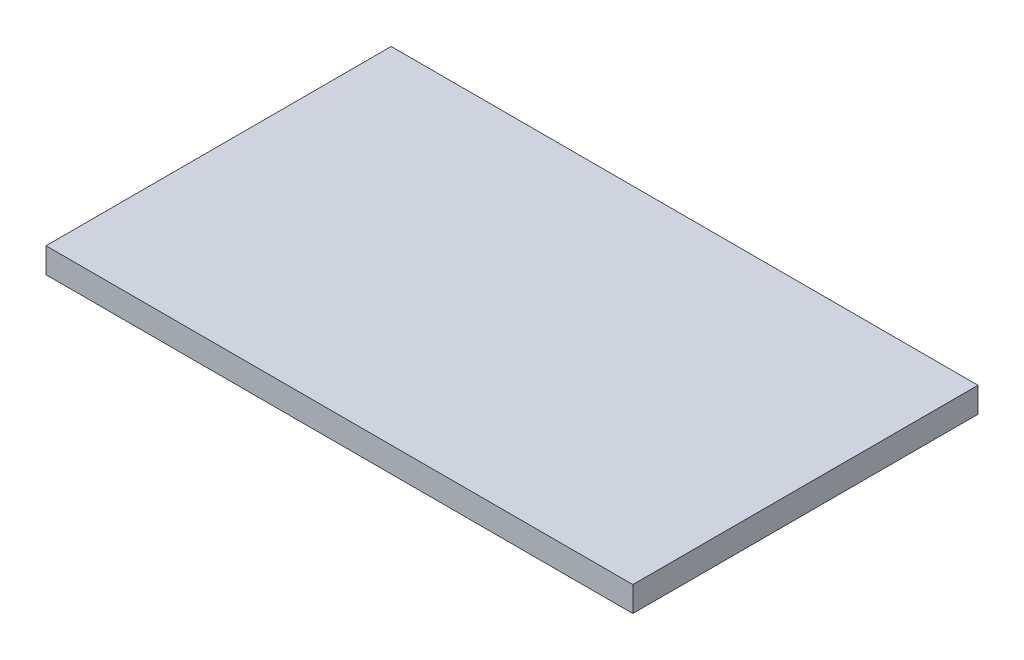
ISO-10303-21;
HEADER;
FILE_DESCRIPTION(('STEP AP214'),'2;1');
FILE_NAME('part.step','',(''),(''),'','','');
FILE_SCHEMA(('AUTOMOTIVE_DESIGN { 1 0 10303 214 1 1 1 1 }'));
ENDSEC;
DATA;
#1=APPLICATION_CONTEXT('core data for automotive mechanical design processes');
#2=APPLICATION_PROTOCOL_DEFINITION('international standard','automotive_design',2000,#1);
#3=PRODUCT_CONTEXT('',#1,'mechanical');
#4=PRODUCT('Part','Part','',(#3));
#5=PRODUCT_RELATED_PRODUCT_CATEGORY('part','',(#4));
#6=PRODUCT_DEFINITION_FORMATION('','',#4);
#7=PRODUCT_DEFINITION_CONTEXT('part definition',#1,'design');
#8=PRODUCT_DEFINITION('design','',#6,#7);
#9=PRODUCT_DEFINITION_SHAPE('','',#8);
#10=(LENGTH_UNIT() NAMED_UNIT(*) SI_UNIT(.MILLI.,.METRE.));
#11=(NAMED_UNIT(*) PLANE_ANGLE_UNIT() SI_UNIT($,.RADIAN.));
#12=(NAMED_UNIT(*) SI_UNIT($,.STERADIAN.) SOLID_ANGLE_UNIT());
#13=UNCERTAINTY_MEASURE_WITH_UNIT(LENGTH_MEASURE(1.E-05),#10,'distance_accuracy_value','');
#14=(GEOMETRIC_REPRESENTATION_CONTEXT(3) GLOBAL_UNCERTAINTY_ASSIGNED_CONTEXT((#13)) GLOBAL_UNIT_ASSIGNED_CONTEXT((#10,
#11,#12)) REPRESENTATION_CONTEXT('',''));
#15=CARTESIAN_POINT('',(0.,0.,0.));
#16=DIRECTION('',(0.,0.,1.));
#17=DIRECTION('',(1.,0.,0.));
#18=AXIS2_PLACEMENT_3D('',#15,#16,#17);
#19=CARTESIAN_POINT('',(18.7,0.8,11.));
#20=DIRECTION('',(-1.,0.,0.));
#21=DIRECTION('',(0.,0.,1.));
#22=AXIS2_PLACEMENT_3D('',#19,#20,#21);
#23=PLANE('',#22);
#24=DIRECTION('',(0.,0.,-1.));
#25=VECTOR('',#24,1.);
#26=CARTESIAN_POINT('',(18.7,-0.8,11.));
#27=LINE('',#26,#25);
#28=CARTESIAN_POINT('',(18.7,-0.8,11.));
#29=VERTEX_POINT('',#28);
#30=CARTESIAN_POINT('',(18.7,-0.8,-11.));
#31=VERTEX_POINT('',#30);
#32=EDGE_CURVE('E96',#29,#31,#27,.T.);
#33=ORIENTED_EDGE('',*,*,#32,.T.);
#34=DIRECTION('',(0.,-1.,0.));
#35=VECTOR('',#34,1.);
#36=CARTESIAN_POINT('',(18.7,0.8,-11.));
#37=LINE('',#36,#35);
#38=CARTESIAN_POINT('',(18.7,0.8,-11.));
#39=VERTEX_POINT('',#38);
#40=EDGE_CURVE('E11',#39,#31,#37,.T.);
#41=ORIENTED_EDGE('',*,*,#40,.F.);
#42=DIRECTION('',(0.,0.,-1.));
#43=VECTOR('',#42,1.);
#44=CARTESIAN_POINT('',(18.7,0.8,11.));
#45=LINE('',#44,#43);
#46=CARTESIAN_POINT('',(18.7,0.8,11.));
#47=VERTEX_POINT('',#46);
#48=EDGE_CURVE('E84',#47,#39,#45,.T.);
#49=ORIENTED_EDGE('',*,*,#48,.F.);
#50=DIRECTION('',(0.,-1.,0.));
#51=VECTOR('',#50,1.);
#52=CARTESIAN_POINT('',(18.7,0.8,11.));
#53=LINE('',#52,#51);
#54=EDGE_CURVE('E92',#47,#29,#53,.T.);
#55=ORIENTED_EDGE('',*,*,#54,.T.);
#56=EDGE_LOOP('',(#33,#41,#49,#55));
#57=FACE_BOUND('',#56,.T.);
#58=ADVANCED_FACE('F33',(#57),#23,.F.);
#59=CARTESIAN_POINT('',(-18.7,0.8,-11.));
#60=DIRECTION('',(0.,0.,1.));
#61=DIRECTION('',(1.,0.,0.));
#62=AXIS2_PLACEMENT_3D('',#59,#60,#61);
#63=PLANE('',#62);
#64=DIRECTION('',(-1.,0.,0.));
#65=VECTOR('',#64,1.);
#66=CARTESIAN_POINT('',(-18.7,-0.8,-11.));
#67=LINE('',#66,#65);
#68=CARTESIAN_POINT('',(-18.7,-0.8,-11.));
#69=VERTEX_POINT('',#68);
#70=EDGE_CURVE('E88',#31,#69,#67,.T.);
#71=ORIENTED_EDGE('',*,*,#70,.T.);
#72=DIRECTION('',(0.,-1.,0.));
#73=VECTOR('',#72,1.);
#74=CARTESIAN_POINT('',(-18.7,0.8,-11.));
#75=LINE('',#74,#73);
#76=CARTESIAN_POINT('',(-18.7,0.8,-11.));
#77=VERTEX_POINT('',#76);
#78=EDGE_CURVE('E41',#77,#69,#75,.T.);
#79=ORIENTED_EDGE('',*,*,#78,.F.);
#80=DIRECTION('',(-1.,0.,0.));
#81=VECTOR('',#80,1.);
#82=CARTESIAN_POINT('',(-18.7,0.8,-11.));
#83=LINE('',#82,#81);
#84=EDGE_CURVE('E79',#39,#77,#83,.T.);
#85=ORIENTED_EDGE('',*,*,#84,.F.);
#86=ORIENTED_EDGE('',*,*,#40,.T.);
#87=EDGE_LOOP('',(#71,#79,#85,#86));
#88=FACE_BOUND('',#87,.T.);
#89=ADVANCED_FACE('F87',(#88),#63,.F.);
#90=CARTESIAN_POINT('',(-18.7,0.8,11.));
#91=DIRECTION('',(1.,0.,0.));
#92=DIRECTION('',(0.,0.,-1.));
#93=AXIS2_PLACEMENT_3D('',#90,#91,#92);
#94=PLANE('',#93);
#95=DIRECTION('',(0.,0.,1.));
#96=VECTOR('',#95,1.);
#97=CARTESIAN_POINT('',(-18.7,-0.8,11.));
#98=LINE('',#97,#96);
#99=CARTESIAN_POINT('',(-18.7,-0.8,11.));
#100=VERTEX_POINT('',#99);
#101=EDGE_CURVE('E66',#69,#100,#98,.T.);
#102=ORIENTED_EDGE('',*,*,#101,.T.);
#103=DIRECTION('',(0.,-1.,0.));
#104=VECTOR('',#103,1.);
#105=CARTESIAN_POINT('',(-18.7,0.8,11.));
#106=LINE('',#105,#104);
#107=CARTESIAN_POINT('',(-18.7,0.8,11.));
#108=VERTEX_POINT('',#107);
#109=EDGE_CURVE('E89',#108,#100,#106,.T.);
#110=ORIENTED_EDGE('',*,*,#109,.F.);
#111=DIRECTION('',(0.,0.,1.));
#112=VECTOR('',#111,1.);
#113=CARTESIAN_POINT('',(-18.7,0.8,11.));
#114=LINE('',#113,#112);
#115=EDGE_CURVE('E82',#77,#108,#114,.T.);
#116=ORIENTED_EDGE('',*,*,#115,.F.);
#117=ORIENTED_EDGE('',*,*,#78,.T.);
#118=EDGE_LOOP('',(#102,#110,#116,#117));
#119=FACE_BOUND('',#118,.T.);
#120=ADVANCED_FACE('F90',(#119),#94,.F.);
#121=CARTESIAN_POINT('',(-18.7,0.8,11.));
#122=DIRECTION('',(0.,0.,-1.));
#123=DIRECTION('',(-1.,0.,0.));
#124=AXIS2_PLACEMENT_3D('',#121,#122,#123);
#125=PLANE('',#124);
#126=DIRECTION('',(1.,0.,0.));
#127=VECTOR('',#126,1.);
#128=CARTESIAN_POINT('',(-18.7,-0.8,11.));
#129=LINE('',#128,#127);
#130=EDGE_CURVE('E72',#100,#29,#129,.T.);
#131=ORIENTED_EDGE('',*,*,#130,.T.);
#132=ORIENTED_EDGE('',*,*,#54,.F.);
#133=DIRECTION('',(1.,0.,0.));
#134=VECTOR('',#133,1.);
#135=CARTESIAN_POINT('',(-18.7,0.8,11.));
#136=LINE('',#135,#134);
#137=EDGE_CURVE('E49',#108,#47,#136,.T.);
#138=ORIENTED_EDGE('',*,*,#137,.F.);
#139=ORIENTED_EDGE('',*,*,#109,.T.);
#140=EDGE_LOOP('',(#131,#132,#138,#139));
#141=FACE_BOUND('',#140,.T.);
#142=ADVANCED_FACE('F103',(#141),#125,.F.);
#143=CARTESIAN_POINT('',(0.,0.8,0.));
#144=DIRECTION('',(0.,-1.,0.));
#145=DIRECTION('',(0.,0.,-1.));
#146=AXIS2_PLACEMENT_3D('',#143,#144,#145);
#147=PLANE('',#146);
#148=ORIENTED_EDGE('',*,*,#48,.T.);
#149=ORIENTED_EDGE('',*,*,#84,.T.);
#150=ORIENTED_EDGE('',*,*,#115,.T.);
#151=ORIENTED_EDGE('',*,*,#137,.T.);
#152=EDGE_LOOP('',(#148,#149,#150,#151));
#153=FACE_BOUND('',#152,.T.);
#154=ADVANCED_FACE('F80',(#153),#147,.F.);
#155=CARTESIAN_POINT('',(0.,-0.8,0.));
#156=DIRECTION('',(0.,-1.,0.));
#157=DIRECTION('',(0.,0.,-1.));
#158=AXIS2_PLACEMENT_3D('',#155,#156,#157);
#159=PLANE('',#158);
#160=ORIENTED_EDGE('',*,*,#32,.F.);
#161=ORIENTED_EDGE('',*,*,#130,.F.);
#162=ORIENTED_EDGE('',*,*,#101,.F.);
#163=ORIENTED_EDGE('',*,*,#70,.F.);
#164=EDGE_LOOP('',(#160,#161,#162,#163));
#165=FACE_BOUND('',#164,.T.);
#166=ADVANCED_FACE('F106',(#165),#159,.T.);
#167=CLOSED_SHELL('',(#58,#89,#120,#142,#154,#166));
#168=MANIFOLD_SOLID_BREP('B2',#167);
#169=ADVANCED_BREP_SHAPE_REPRESENTATION('',(#18,#168),#14);
#170=SHAPE_DEFINITION_REPRESENTATION(#9,#169);
ENDSEC;
END-ISO-10303-21;
